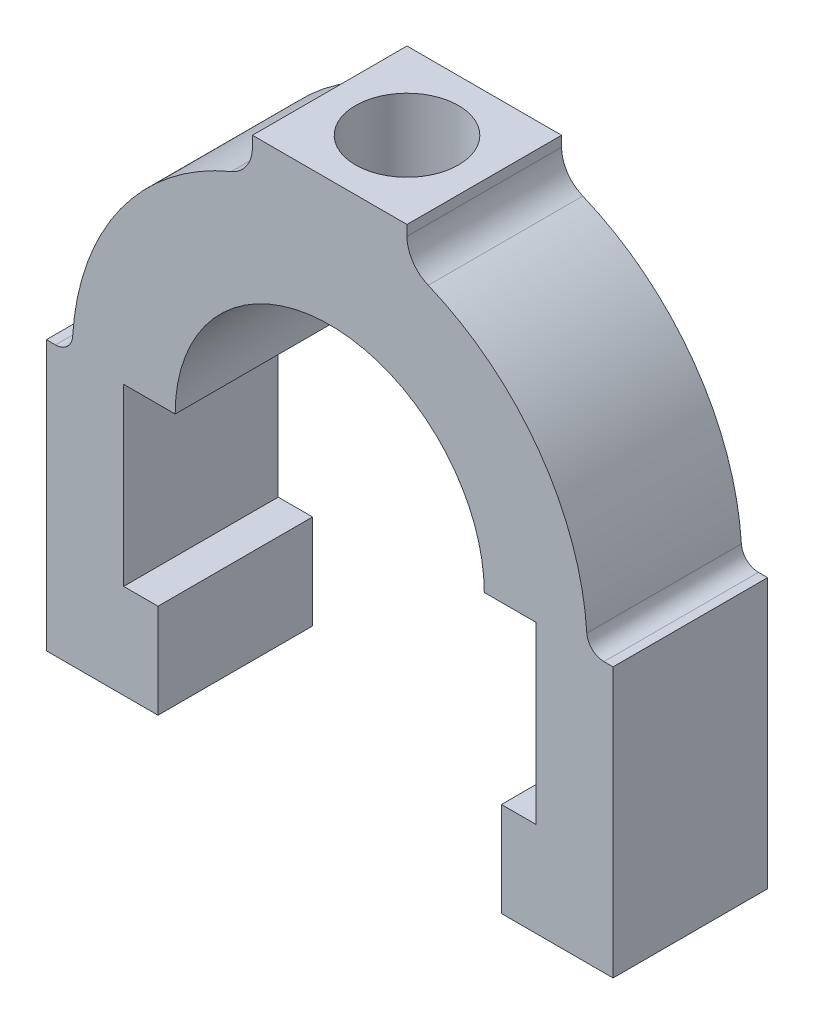
ISO-10303-21;
HEADER;
FILE_DESCRIPTION(('STEP AP214'),'2;1');
FILE_NAME('part.step','',(''),(''),'','','');
FILE_SCHEMA(('AUTOMOTIVE_DESIGN { 1 0 10303 214 1 1 1 1 }'));
ENDSEC;
DATA;
#1=APPLICATION_CONTEXT('core data for automotive mechanical design processes');
#2=APPLICATION_PROTOCOL_DEFINITION('international standard','automotive_design',2000,#1);
#3=PRODUCT_CONTEXT('',#1,'mechanical');
#4=PRODUCT('Part','Part','',(#3));
#5=PRODUCT_RELATED_PRODUCT_CATEGORY('part','',(#4));
#6=PRODUCT_DEFINITION_FORMATION('','',#4);
#7=PRODUCT_DEFINITION_CONTEXT('part definition',#1,'design');
#8=PRODUCT_DEFINITION('design','',#6,#7);
#9=PRODUCT_DEFINITION_SHAPE('','',#8);
#10=(LENGTH_UNIT() NAMED_UNIT(*) SI_UNIT(.MILLI.,.METRE.));
#11=(NAMED_UNIT(*) PLANE_ANGLE_UNIT() SI_UNIT($,.RADIAN.));
#12=(NAMED_UNIT(*) SI_UNIT($,.STERADIAN.) SOLID_ANGLE_UNIT());
#13=UNCERTAINTY_MEASURE_WITH_UNIT(LENGTH_MEASURE(1.E-05),#10,'distance_accuracy_value','');
#14=(GEOMETRIC_REPRESENTATION_CONTEXT(3) GLOBAL_UNCERTAINTY_ASSIGNED_CONTEXT((#13)) GLOBAL_UNIT_ASSIGNED_CONTEXT((#10,
#11,#12)) REPRESENTATION_CONTEXT('',''));
#15=CARTESIAN_POINT('',(0.,0.,0.));
#16=DIRECTION('',(0.,0.,1.));
#17=DIRECTION('',(1.,0.,0.));
#18=AXIS2_PLACEMENT_3D('',#15,#16,#17);
#19=CARTESIAN_POINT('',(0.,0.,9.));
#20=DIRECTION('',(0.,0.,-1.));
#21=DIRECTION('',(-1.,0.,0.));
#22=AXIS2_PLACEMENT_3D('',#19,#20,#21);
#23=CYLINDRICAL_SURFACE('',#22,30.);
#24=CARTESIAN_POINT('',(0.,0.,-9.));
#25=DIRECTION('',(0.,0.,1.));
#26=DIRECTION('',(-1.,0.,0.));
#27=AXIS2_PLACEMENT_3D('',#24,#25,#26);
#28=CIRCLE('',#27,30.);
#29=CARTESIAN_POINT('',(-11.4705882352941,27.7204907160088,-9.));
#30=VERTEX_POINT('',#29);
#31=CARTESIAN_POINT('',(-29.9413489175087,1.875,-9.));
#32=VERTEX_POINT('',#31);
#33=EDGE_CURVE('E292',#30,#32,#28,.T.);
#34=ORIENTED_EDGE('',*,*,#33,.T.);
#35=DIRECTION('',(0.,0.,-1.));
#36=VECTOR('',#35,1.);
#37=CARTESIAN_POINT('',(-29.9413489175087,1.875,9.));
#38=LINE('',#37,#36);
#39=CARTESIAN_POINT('',(-29.9413489175087,1.875,9.));
#40=VERTEX_POINT('',#39);
#41=EDGE_CURVE('E441',#32,#40,#38,.F.);
#42=ORIENTED_EDGE('',*,*,#41,.T.);
#43=CARTESIAN_POINT('',(0.,0.,9.));
#44=DIRECTION('',(0.,0.,1.));
#45=DIRECTION('',(-1.,0.,0.));
#46=AXIS2_PLACEMENT_3D('',#43,#44,#45);
#47=CIRCLE('',#46,30.);
#48=CARTESIAN_POINT('',(-11.4705882352941,27.7204907160088,9.));
#49=VERTEX_POINT('',#48);
#50=EDGE_CURVE('E220',#49,#40,#47,.T.);
#51=ORIENTED_EDGE('',*,*,#50,.F.);
#52=DIRECTION('',(0.,0.,-1.));
#53=VECTOR('',#52,1.);
#54=CARTESIAN_POINT('',(-11.4705882352941,27.7204907160088,9.));
#55=LINE('',#54,#53);
#56=EDGE_CURVE('E230',#49,#30,#55,.T.);
#57=ORIENTED_EDGE('',*,*,#56,.T.);
#58=EDGE_LOOP('',(#34,#42,#51,#57));
#59=FACE_BOUND('',#58,.T.);
#60=ADVANCED_FACE('F45',(#59),#23,.T.);
#61=CARTESIAN_POINT('',(-30.,0.,9.));
#62=DIRECTION('',(0.,-1.,0.));
#63=DIRECTION('',(1.,0.,0.));
#64=AXIS2_PLACEMENT_3D('',#61,#62,#63);
#65=PLANE('',#64);
#66=DIRECTION('',(-1.,0.,0.));
#67=VECTOR('',#66,1.);
#68=CARTESIAN_POINT('',(-30.,0.,9.));
#69=LINE('',#68,#67);
#70=CARTESIAN_POINT('',(-31.9374388453426,0.,9.));
#71=VERTEX_POINT('',#70);
#72=CARTESIAN_POINT('',(-33.,0.,9.));
#73=VERTEX_POINT('',#72);
#74=EDGE_CURVE('E206',#71,#73,#69,.T.);
#75=ORIENTED_EDGE('',*,*,#74,.F.);
#76=DIRECTION('',(0.,0.,1.));
#77=VECTOR('',#76,1.);
#78=CARTESIAN_POINT('',(-31.9374388453426,0.,-9.));
#79=LINE('',#78,#77);
#80=CARTESIAN_POINT('',(-31.9374388453426,0.,-9.));
#81=VERTEX_POINT('',#80);
#82=EDGE_CURVE('E438',#71,#81,#79,.F.);
#83=ORIENTED_EDGE('',*,*,#82,.T.);
#84=DIRECTION('',(-1.,0.,0.));
#85=VECTOR('',#84,1.);
#86=CARTESIAN_POINT('',(-30.,0.,-9.));
#87=LINE('',#86,#85);
#88=CARTESIAN_POINT('',(-33.,0.,-9.));
#89=VERTEX_POINT('',#88);
#90=EDGE_CURVE('E226',#81,#89,#87,.T.);
#91=ORIENTED_EDGE('',*,*,#90,.T.);
#92=DIRECTION('',(0.,0.,-1.));
#93=VECTOR('',#92,1.);
#94=CARTESIAN_POINT('',(-33.,0.,9.));
#95=LINE('',#94,#93);
#96=EDGE_CURVE('E223',#73,#89,#95,.T.);
#97=ORIENTED_EDGE('',*,*,#96,.F.);
#98=EDGE_LOOP('',(#75,#83,#91,#97));
#99=FACE_BOUND('',#98,.T.);
#100=ADVANCED_FACE('F224',(#99),#65,.F.);
#101=CARTESIAN_POINT('',(-33.,0.,9.));
#102=DIRECTION('',(1.,0.,0.));
#103=DIRECTION('',(0.,1.,0.));
#104=AXIS2_PLACEMENT_3D('',#101,#102,#103);
#105=PLANE('',#104);
#106=DIRECTION('',(0.,-1.,0.));
#107=VECTOR('',#106,1.);
#108=CARTESIAN_POINT('',(-33.,0.,-9.));
#109=LINE('',#108,#107);
#110=CARTESIAN_POINT('',(-33.,-31.3818239574916,-9.));
#111=VERTEX_POINT('',#110);
#112=EDGE_CURVE('E299',#89,#111,#109,.T.);
#113=ORIENTED_EDGE('',*,*,#112,.T.);
#114=DIRECTION('',(0.,0.,-1.));
#115=VECTOR('',#114,1.);
#116=CARTESIAN_POINT('',(-33.,-31.3818239574916,9.));
#117=LINE('',#116,#115);
#118=CARTESIAN_POINT('',(-33.,-31.3818239574916,9.));
#119=VERTEX_POINT('',#118);
#120=EDGE_CURVE('E231',#119,#111,#117,.T.);
#121=ORIENTED_EDGE('',*,*,#120,.F.);
#122=DIRECTION('',(0.,-1.,0.));
#123=VECTOR('',#122,1.);
#124=CARTESIAN_POINT('',(-33.,0.,9.));
#125=LINE('',#124,#123);
#126=EDGE_CURVE('E211',#73,#119,#125,.T.);
#127=ORIENTED_EDGE('',*,*,#126,.F.);
#128=ORIENTED_EDGE('',*,*,#96,.T.);
#129=EDGE_LOOP('',(#113,#121,#127,#128));
#130=FACE_BOUND('',#129,.T.);
#131=ADVANCED_FACE('F233',(#130),#105,.F.);
#132=CARTESIAN_POINT('',(-33.,-31.3818239574916,9.));
#133=DIRECTION('',(0.,1.,0.));
#134=DIRECTION('',(0.,0.,1.));
#135=AXIS2_PLACEMENT_3D('',#132,#133,#134);
#136=PLANE('',#135);
#137=DIRECTION('',(1.,0.,0.));
#138=VECTOR('',#137,1.);
#139=CARTESIAN_POINT('',(-33.,-31.3818239574916,-9.));
#140=LINE('',#139,#138);
#141=CARTESIAN_POINT('',(-20.,-31.3818239574916,-9.));
#142=VERTEX_POINT('',#141);
#143=EDGE_CURVE('E302',#111,#142,#140,.T.);
#144=ORIENTED_EDGE('',*,*,#143,.T.);
#145=DIRECTION('',(0.,0.,-1.));
#146=VECTOR('',#145,1.);
#147=CARTESIAN_POINT('',(-20.,-31.3818239574916,9.));
#148=LINE('',#147,#146);
#149=CARTESIAN_POINT('',(-20.,-31.3818239574916,9.));
#150=VERTEX_POINT('',#149);
#151=EDGE_CURVE('E405',#150,#142,#148,.T.);
#152=ORIENTED_EDGE('',*,*,#151,.F.);
#153=DIRECTION('',(1.,0.,0.));
#154=VECTOR('',#153,1.);
#155=CARTESIAN_POINT('',(-33.,-31.3818239574916,9.));
#156=LINE('',#155,#154);
#157=EDGE_CURVE('E237',#119,#150,#156,.T.);
#158=ORIENTED_EDGE('',*,*,#157,.F.);
#159=ORIENTED_EDGE('',*,*,#120,.T.);
#160=EDGE_LOOP('',(#144,#152,#158,#159));
#161=FACE_BOUND('',#160,.T.);
#162=ADVANCED_FACE('F587',(#161),#136,.F.);
#163=CARTESIAN_POINT('',(-20.,-31.3818239574916,9.));
#164=DIRECTION('',(-1.,0.,0.));
#165=DIRECTION('',(0.,0.,1.));
#166=AXIS2_PLACEMENT_3D('',#163,#164,#165);
#167=PLANE('',#166);
#168=DIRECTION('',(0.,1.,0.));
#169=VECTOR('',#168,1.);
#170=CARTESIAN_POINT('',(-20.,-31.3818239574916,-9.));
#171=LINE('',#170,#169);
#172=CARTESIAN_POINT('',(-20.,-20.3818239574916,-9.));
#173=VERTEX_POINT('',#172);
#174=EDGE_CURVE('E305',#142,#173,#171,.T.);
#175=ORIENTED_EDGE('',*,*,#174,.T.);
#176=DIRECTION('',(0.,0.,-1.));
#177=VECTOR('',#176,1.);
#178=CARTESIAN_POINT('',(-20.,-20.3818239574916,9.));
#179=LINE('',#178,#177);
#180=CARTESIAN_POINT('',(-20.,-20.3818239574916,9.));
#181=VERTEX_POINT('',#180);
#182=EDGE_CURVE('E401',#181,#173,#179,.T.);
#183=ORIENTED_EDGE('',*,*,#182,.F.);
#184=DIRECTION('',(0.,1.,0.));
#185=VECTOR('',#184,1.);
#186=CARTESIAN_POINT('',(-20.,-31.3818239574916,9.));
#187=LINE('',#186,#185);
#188=EDGE_CURVE('E240',#150,#181,#187,.T.);
#189=ORIENTED_EDGE('',*,*,#188,.F.);
#190=ORIENTED_EDGE('',*,*,#151,.T.);
#191=EDGE_LOOP('',(#175,#183,#189,#190));
#192=FACE_BOUND('',#191,.T.);
#193=ADVANCED_FACE('F583',(#192),#167,.F.);
#194=CARTESIAN_POINT('',(-20.,-20.3818239574916,9.));
#195=DIRECTION('',(0.,-1.,0.));
#196=DIRECTION('',(0.,0.,-1.));
#197=AXIS2_PLACEMENT_3D('',#194,#195,#196);
#198=PLANE('',#197);
#199=DIRECTION('',(-1.,0.,0.));
#200=VECTOR('',#199,1.);
#201=CARTESIAN_POINT('',(-20.,-20.3818239574916,-9.));
#202=LINE('',#201,#200);
#203=CARTESIAN_POINT('',(-24.,-20.3818239574916,-9.));
#204=VERTEX_POINT('',#203);
#205=EDGE_CURVE('E308',#173,#204,#202,.T.);
#206=ORIENTED_EDGE('',*,*,#205,.T.);
#207=DIRECTION('',(0.,0.,-1.));
#208=VECTOR('',#207,1.);
#209=CARTESIAN_POINT('',(-24.,-20.3818239574916,9.));
#210=LINE('',#209,#208);
#211=CARTESIAN_POINT('',(-24.,-20.3818239574916,9.));
#212=VERTEX_POINT('',#211);
#213=EDGE_CURVE('E397',#212,#204,#210,.T.);
#214=ORIENTED_EDGE('',*,*,#213,.F.);
#215=DIRECTION('',(-1.,0.,0.));
#216=VECTOR('',#215,1.);
#217=CARTESIAN_POINT('',(-20.,-20.3818239574916,9.));
#218=LINE('',#217,#216);
#219=EDGE_CURVE('E246',#181,#212,#218,.T.);
#220=ORIENTED_EDGE('',*,*,#219,.F.);
#221=ORIENTED_EDGE('',*,*,#182,.T.);
#222=EDGE_LOOP('',(#206,#214,#220,#221));
#223=FACE_BOUND('',#222,.T.);
#224=ADVANCED_FACE('F579',(#223),#198,.F.);
#225=CARTESIAN_POINT('',(-24.,-20.3818239574916,9.));
#226=DIRECTION('',(-1.,0.,0.));
#227=DIRECTION('',(0.,0.,1.));
#228=AXIS2_PLACEMENT_3D('',#225,#226,#227);
#229=PLANE('',#228);
#230=DIRECTION('',(0.,1.,0.));
#231=VECTOR('',#230,1.);
#232=CARTESIAN_POINT('',(-24.,-20.3818239574916,-9.));
#233=LINE('',#232,#231);
#234=CARTESIAN_POINT('',(-24.,0.,-9.));
#235=VERTEX_POINT('',#234);
#236=EDGE_CURVE('E311',#204,#235,#233,.T.);
#237=ORIENTED_EDGE('',*,*,#236,.T.);
#238=DIRECTION('',(0.,0.,-1.));
#239=VECTOR('',#238,1.);
#240=CARTESIAN_POINT('',(-24.,0.,9.));
#241=LINE('',#240,#239);
#242=CARTESIAN_POINT('',(-24.,0.,9.));
#243=VERTEX_POINT('',#242);
#244=EDGE_CURVE('E393',#243,#235,#241,.T.);
#245=ORIENTED_EDGE('',*,*,#244,.F.);
#246=DIRECTION('',(0.,1.,0.));
#247=VECTOR('',#246,1.);
#248=CARTESIAN_POINT('',(-24.,-20.3818239574916,9.));
#249=LINE('',#248,#247);
#250=EDGE_CURVE('E249',#212,#243,#249,.T.);
#251=ORIENTED_EDGE('',*,*,#250,.F.);
#252=ORIENTED_EDGE('',*,*,#213,.T.);
#253=EDGE_LOOP('',(#237,#245,#251,#252));
#254=FACE_BOUND('',#253,.T.);
#255=ADVANCED_FACE('F575',(#254),#229,.F.);
#256=CARTESIAN_POINT('',(-24.,0.,9.));
#257=DIRECTION('',(0.,1.,0.));
#258=DIRECTION('',(-1.,0.,0.));
#259=AXIS2_PLACEMENT_3D('',#256,#257,#258);
#260=PLANE('',#259);
#261=DIRECTION('',(1.,0.,0.));
#262=VECTOR('',#261,1.);
#263=CARTESIAN_POINT('',(-24.,0.,-9.));
#264=LINE('',#263,#262);
#265=CARTESIAN_POINT('',(-18.,0.,-9.));
#266=VERTEX_POINT('',#265);
#267=EDGE_CURVE('E314',#235,#266,#264,.T.);
#268=ORIENTED_EDGE('',*,*,#267,.T.);
#269=DIRECTION('',(0.,0.,-1.));
#270=VECTOR('',#269,1.);
#271=CARTESIAN_POINT('',(-18.,0.,9.));
#272=LINE('',#271,#270);
#273=CARTESIAN_POINT('',(-18.,0.,9.));
#274=VERTEX_POINT('',#273);
#275=EDGE_CURVE('E389',#274,#266,#272,.T.);
#276=ORIENTED_EDGE('',*,*,#275,.F.);
#277=DIRECTION('',(1.,0.,0.));
#278=VECTOR('',#277,1.);
#279=CARTESIAN_POINT('',(-24.,0.,9.));
#280=LINE('',#279,#278);
#281=EDGE_CURVE('E252',#243,#274,#280,.T.);
#282=ORIENTED_EDGE('',*,*,#281,.F.);
#283=ORIENTED_EDGE('',*,*,#244,.T.);
#284=EDGE_LOOP('',(#268,#276,#282,#283));
#285=FACE_BOUND('',#284,.T.);
#286=ADVANCED_FACE('F571',(#285),#260,.F.);
#287=CARTESIAN_POINT('',(0.,0.,9.));
#288=DIRECTION('',(0.,0.,-1.));
#289=DIRECTION('',(-1.,0.,0.));
#290=AXIS2_PLACEMENT_3D('',#287,#288,#289);
#291=CYLINDRICAL_SURFACE('',#290,18.);
#292=CARTESIAN_POINT('',(0.,18.,6.00000000000001));
#293=CARTESIAN_POINT('',(0.327379650289655,18.000001123506,6.0000023265047));
#294=CARTESIAN_POINT('',(0.654748688533562,17.9909867942918,5.97312070517746));
#295=CARTESIAN_POINT('',(1.29985304419291,17.9559119882929,5.86662304491696));
#296=CARTESIAN_POINT('',(1.61758735790783,17.9298497418759,5.78700153139131));
#297=CARTESIAN_POINT('',(2.23398736346928,17.8635207608215,5.57809293059833));
#298=CARTESIAN_POINT('',(2.53268396310175,17.8232777801419,5.44888886636663));
#299=CARTESIAN_POINT('',(3.1042846199529,17.7326582250689,5.14472171568156));
#300=CARTESIAN_POINT('',(3.37718357480982,17.6822796521554,4.96974960271144));
#301=CARTESIAN_POINT('',(3.76616319556053,17.6021139762513,4.67373393790122));
#302=CARTESIAN_POINT('',(3.8942294180292,17.5741584828372,4.56756247056504));
#303=CARTESIAN_POINT('',(4.14103139160447,17.5176437471481,4.34504566324369));
#304=CARTESIAN_POINT('',(4.25977020760167,17.4890847071399,4.22870369195644));
#305=CARTESIAN_POINT('',(4.48726302616458,17.4321038412202,3.98649013598117));
#306=CARTESIAN_POINT('',(4.59601129158695,17.4036821029209,3.86061315050774));
#307=CARTESIAN_POINT('',(4.80273826983803,17.3477712002834,3.60018484220802));
#308=CARTESIAN_POINT('',(4.90072088829396,17.3202817002612,3.46563669345216));
#309=CARTESIAN_POINT('',(5.08800724585023,17.2662087032665,3.18457637712881));
#310=CARTESIAN_POINT('',(5.17697354503101,17.2396751826829,3.03782944671992));
#311=CARTESIAN_POINT('',(5.34214016777295,17.1892116232901,2.736964636426));
#312=CARTESIAN_POINT('',(5.41834554335252,17.1652805554979,2.58284970472632));
#313=CARTESIAN_POINT('',(5.55741169583797,17.1207625674418,2.2682071931852));
#314=CARTESIAN_POINT('',(5.62027009739617,17.1001762425913,2.10767847791904));
#315=CARTESIAN_POINT('',(5.73202691492454,17.0630401245342,1.78145414427482));
#316=CARTESIAN_POINT('',(5.78093169214337,17.0464884924745,1.615760918658));
#317=CARTESIAN_POINT('',(5.86294638495678,17.0184510407943,1.2859862068502));
#318=CARTESIAN_POINT('',(5.89652807287009,17.0068148729862,1.12203481043606));
#319=CARTESIAN_POINT('',(5.94988922941377,16.9882200160252,0.79170422793202));
#320=CARTESIAN_POINT('',(5.96967445275638,16.981259376684,0.625326083675579));
#321=CARTESIAN_POINT('',(5.99526000389047,16.972243291642,0.291376402534221));
#322=CARTESIAN_POINT('',(6.00106129575105,16.9701875077948,0.123804948716409));
#323=CARTESIAN_POINT('',(5.99862030680245,16.9710505580302,-0.21122026460354));
#324=CARTESIAN_POINT('',(5.99037842226284,16.9739692517434,-0.378674027293289));
#325=CARTESIAN_POINT('',(5.96063984942074,16.9844341754675,-0.7044792823855));
#326=CARTESIAN_POINT('',(5.93976958041475,16.9917616219287,-0.862895480150734));
#327=CARTESIAN_POINT('',(5.88551353932248,17.0106306342449,-1.17736899795067));
#328=CARTESIAN_POINT('',(5.8521235554091,17.0221736182384,-1.33342550574807));
#329=CARTESIAN_POINT('',(5.7731374155462,17.0491237940853,-1.64202527661949));
#330=CARTESIAN_POINT('',(5.72754467937087,17.0645299032367,-1.79456951100698));
#331=CARTESIAN_POINT('',(5.62451111134525,17.0987666198765,-2.09526716026518));
#332=CARTESIAN_POINT('',(5.5670657806024,17.1175985273741,-2.24341888337636));
#333=CARTESIAN_POINT('',(5.43978996961936,17.1584737023369,-2.53665776063388));
#334=CARTESIAN_POINT('',(5.36977902106656,17.1805627911335,-2.68166015095766));
#335=CARTESIAN_POINT('',(5.21849496708249,17.2271173682882,-2.96532612102853));
#336=CARTESIAN_POINT('',(5.13721801376244,17.2515836677221,-3.1039875134049));
#337=CARTESIAN_POINT('',(4.96396506342482,17.3022308894506,-3.37413724932027));
#338=CARTESIAN_POINT('',(4.87198833374049,17.3284119291083,-3.50562510074467));
#339=CARTESIAN_POINT('',(4.67791711233443,17.3818071133135,-3.76068799264569));
#340=CARTESIAN_POINT('',(4.57582226284314,17.4090212943713,-3.8842627530665));
#341=CARTESIAN_POINT('',(4.35651092167621,17.4652307681598,-4.12906952466076));
#342=CARTESIAN_POINT('',(4.23878222552779,17.4942446291105,-4.24983892079909));
#343=CARTESIAN_POINT('',(3.99356544234078,17.5518457645375,-4.48105174840134));
#344=CARTESIAN_POINT('',(3.86608044237211,17.5804331705585,-4.5914984217909));
#345=CARTESIAN_POINT('',(3.60203839398285,17.6364264431102,-4.8014351482675));
#346=CARTESIAN_POINT('',(3.46547705844156,17.66383174106,-4.90091996380797));
#347=CARTESIAN_POINT('',(3.18424141551367,17.716688947922,-5.08813625898337));
#348=CARTESIAN_POINT('',(3.03957034912589,17.7421416276874,-5.17587238706145));
#349=CARTESIAN_POINT('',(2.74144779789668,17.7906577486565,-5.33982218022585));
#350=CARTESIAN_POINT('',(2.58792073088706,17.8136936325711,-5.41590672225529));
#351=CARTESIAN_POINT('',(2.27458592506743,17.8564062976005,-5.55478281972534));
#352=CARTESIAN_POINT('',(2.11478068961971,17.8760844012064,-5.61757961101266));
#353=CARTESIAN_POINT('',(1.78999322259957,17.9115215641534,-5.72934687582175));
#354=CARTESIAN_POINT('',(1.62501139705281,17.9272809299996,-5.77831843072819));
#355=CARTESIAN_POINT('',(1.29111086658729,17.954416785468,-5.86196640014444));
#356=CARTESIAN_POINT('',(1.12219234324136,17.9657934768103,-5.89664347258733));
#357=CARTESIAN_POINT('',(0.789168788155053,17.9834311786537,-5.95016009506113));
#358=CARTESIAN_POINT('',(0.625174437128374,17.9898933737321,-5.96962351896456));
#359=CARTESIAN_POINT('',(0.295964203150349,17.9983200246332,-5.99497023123316));
#360=CARTESIAN_POINT('',(0.130747919465907,18.0002829327427,-6.00084884655548));
#361=CARTESIAN_POINT('',(-0.199509552434276,17.9996513983649,-5.99895414534772));
#362=CARTESIAN_POINT('',(-0.364550787039309,17.9970593541922,-5.99118801317439));
#363=CARTESIAN_POINT('',(-0.693361592702053,17.9873931413008,-5.96208858365364));
#364=CARTESIAN_POINT('',(-0.857130672286745,17.9803173198124,-5.94075028344478));
#365=CARTESIAN_POINT('',(-1.17733651912546,17.9621501229369,-5.885532591795));
#366=CARTESIAN_POINT('',(-1.33384731153101,17.9511829004167,-5.85204028867007));
#367=CARTESIAN_POINT('',(-1.64345814456252,17.9254899139335,-5.77274582664115));
#368=CARTESIAN_POINT('',(-1.79655695572469,17.910762818218,-5.72693930571762));
#369=CARTESIAN_POINT('',(-2.0982565498418,17.8779285210375,-5.62340992963252));
#370=CARTESIAN_POINT('',(-2.24685853242728,17.8598222304539,-5.56569028527878));
#371=CARTESIAN_POINT('',(-2.53870192503155,17.8206824064423,-5.43878203882837));
#372=CARTESIAN_POINT('',(-2.68194138840117,17.7996478228409,-5.36958932043648));
#373=CARTESIAN_POINT('',(-3.10955308705348,17.7317545667084,-5.14165694660146));
#374=CARTESIAN_POINT('',(-3.38410495409262,17.6809813742354,-4.96520880969209));
#375=CARTESIAN_POINT('',(-3.90046380489827,17.5743027422684,-4.57077871329005));
#376=CARTESIAN_POINT('',(-4.14226074948704,17.5183957380628,-4.35278406910609));
#377=CARTESIAN_POINT('',(-4.48120075410061,17.4336826212657,-3.9934553932898));
#378=CARTESIAN_POINT('',(-4.59235115980605,17.4046627531,-3.86511883684043));
#379=CARTESIAN_POINT('',(-4.80346249277619,17.3475844522084,-3.59937617807722));
#380=CARTESIAN_POINT('',(-4.9034273442786,17.3195256847111,-3.46197328357883));
#381=CARTESIAN_POINT('',(-5.09152241657998,17.2651671618791,-3.17888353544383));
#382=CARTESIAN_POINT('',(-5.17964753663558,17.2388681671157,-3.03319314965323));
#383=CARTESIAN_POINT('',(-5.34332580832153,17.1888391626455,-2.73456481947393));
#384=CARTESIAN_POINT('',(-5.41888421002776,17.1651080815805,-2.58162993614711));
#385=CARTESIAN_POINT('',(-5.55674325657251,17.1209765842434,-2.26972057554986));
#386=CARTESIAN_POINT('',(-5.61906451465578,17.1005710011209,-2.11075594980542));
#387=CARTESIAN_POINT('',(-5.73001985812799,17.0637127452484,-1.78774169753999));
#388=CARTESIAN_POINT('',(-5.77865956483044,17.047258449448,-1.62369419025971));
#389=CARTESIAN_POINT('',(-5.86180765260837,17.0188467426427,-1.29169994447399));
#390=CARTESIAN_POINT('',(-5.89631843745228,17.0068885667365,-1.12375387437705));
#391=CARTESIAN_POINT('',(-5.95086210077739,16.9878803440502,-0.785254584220835));
#392=CARTESIAN_POINT('',(-5.97089570887974,16.980830049923,-0.614701495992567));
#393=CARTESIAN_POINT('',(-5.99561670735592,16.9721165300556,-0.281210688256416));
#394=CARTESIAN_POINT('',(-6.00104252908575,16.9701941359792,-0.118334053779589));
#395=CARTESIAN_POINT('',(-5.99862718574831,16.971048132718,0.207366276937523));
#396=CARTESIAN_POINT('',(-5.99078151118915,16.9738261206655,0.370189936373837));
#397=CARTESIAN_POINT('',(-5.96189837770534,16.9839924705695,0.694443088382819));
#398=CARTESIAN_POINT('',(-5.94086667700385,16.9913788200877,0.855873158345242));
#399=CARTESIAN_POINT('',(-5.88580987344676,17.010528799585,1.17629853099465));
#400=CARTESIAN_POINT('',(-5.85177988955103,17.02229407387,1.33529289568337));
#401=CARTESIAN_POINT('',(-5.77182751147201,17.0495675106714,1.64661267600511));
#402=CARTESIAN_POINT('',(-5.72614898895514,17.0649985214979,1.79900764331357));
#403=CARTESIAN_POINT('',(-5.62296574413083,17.0992751394136,2.09940161935453));
#404=CARTESIAN_POINT('',(-5.56545681111229,17.1181219619827,2.24739904137767));
#405=CARTESIAN_POINT('',(-5.43907961849349,17.1586949560773,2.53801399942579));
#406=CARTESIAN_POINT('',(-5.37021353557007,17.1804205757049,2.68063255992394));
#407=CARTESIAN_POINT('',(-5.22158108093292,17.2261759837312,2.95974746357768));
#408=CARTESIAN_POINT('',(-5.14181056316171,17.2502066475064,3.09624145171727));
#409=CARTESIAN_POINT('',(-4.96822239816028,17.3010197763056,3.36806664670174));
#410=CARTESIAN_POINT('',(-4.87394621391853,17.3278763260538,3.50309185339549));
#411=CARTESIAN_POINT('',(-4.67473803525017,17.3826786842874,3.76482594594378));
#412=CARTESIAN_POINT('',(-4.56980207786682,17.4106248954769,3.8915317098669));
#413=CARTESIAN_POINT('',(-4.23997033318676,17.4949712765604,4.2579908065868));
#414=CARTESIAN_POINT('',(-3.99991932392138,17.5519192865978,4.48429107663514));
#415=CARTESIAN_POINT('',(-3.47541732325492,17.6634103595779,4.9029084248834));
#416=CARTESIAN_POINT('',(-3.18960052896001,17.7177731925948,5.09355732051543));
#417=CARTESIAN_POINT('',(-2.58815269428971,17.815557186422,5.42393134196919));
#418=CARTESIAN_POINT('',(-2.27252930193347,17.8589811435868,5.56366948642237));
#419=CARTESIAN_POINT('',(-1.63495978805023,17.9283314877085,5.78233265049631));
#420=CARTESIAN_POINT('',(-1.31392615559421,17.9549529431752,5.86369571468174));
#421=CARTESIAN_POINT('',(-0.6619228864178,17.9907842260842,5.97252076721479));
#422=CARTESIAN_POINT('',(-0.330956020624391,17.9999988642206,5.99999764808006));
#423=CARTESIAN_POINT('',(0.,18.,6.00000000000001));
#424=B_SPLINE_CURVE_WITH_KNOTS('',3,(#292,#293,#294,#295,#296,#297,#298,#299,#300,#301,#302,
#303,#304,#305,#306,#307,#308,#309,#310,#311,#312,#313,#314,#315,#316,#317,#318,#319,#320,#321,
#322,#323,#324,#325,#326,#327,#328,#329,#330,#331,#332,#333,#334,#335,#336,#337,#338,#339,#340,
#341,#342,#343,#344,#345,#346,#347,#348,#349,#350,#351,#352,#353,#354,#355,#356,#357,#358,#359,
#360,#361,#362,#363,#364,#365,#366,#367,#368,#369,#370,#371,#372,#373,#374,#375,#376,#377,#378,
#379,#380,#381,#382,#383,#384,#385,#386,#387,#388,#389,#390,#391,#392,#393,#394,#395,#396,#397,
#398,#399,#400,#401,#402,#403,#404,#405,#406,#407,#408,#409,#410,#411,#412,#413,#414,#415,#416,
#417,#418,#419,#420,#421,#422,#423),.UNSPECIFIED.,.T.,.F.,(4,2,2,2,2,2,2,2,2,2,2,2,2,2,2,2,2,2,
2,2,2,2,2,2,2,2,2,2,2,2,2,2,2,2,2,2,2,2,2,2,2,2,2,2,2,2,2,2,2,2,2,2,2,2,2,2,2,2,2,2,2,2,2,2,2,
4),(0.,0.980922636156068,1.96194711160513,2.94133603722165,3.92091826679461,4.42650795800367,
4.93193081656493,5.43764212680677,5.94316936197256,6.46347458360148,6.98357332815681,
7.50376455673093,8.02371825760203,8.52635611322415,9.02878418544485,9.53117761867723,
10.0335568756344,10.5128532711172,10.9923110542535,11.4716346116346,11.9511404417982,
12.4381827239463,12.9253917665144,13.4126341903618,13.8998938489077,14.4127033790737,
14.9253513126936,15.4382431356103,15.9509314262095,16.4689439882804,16.9867520532929,
17.5045196050785,18.0222633228811,18.517462598168,19.0128321918786,19.5079410372374,
20.003232491415,20.4839646652066,20.9648673518609,21.4456405951742,21.9265867044307,
22.9127919780087,23.899298836698,24.4155088763846,24.931537242041,25.4477872128305,
25.9638209619367,26.4790451400542,26.9940573187272,27.5089818413857,28.0238804110535,
28.5122138127281,29.0007131774442,29.4889993671702,29.9774690958509,30.4564495222617,
30.9356007245367,31.4146602006447,31.8939023328471,32.3938860688241,32.8940563675105,
33.8936650334289,34.9322320161082,35.9705332351496,36.962445868431,37.9540843282906),.UNSPECIFIED.);
#425=CARTESIAN_POINT('',(0.,18.,6.00000000000001));
#426=VERTEX_POINT('',#425);
#427=EDGE_CURVE('E296',#426,#426,#424,.T.);
#428=ORIENTED_EDGE('',*,*,#427,.T.);
#429=EDGE_LOOP('',(#428));
#430=FACE_BOUND('',#429,.T.);
#431=CARTESIAN_POINT('',(0.,0.,-9.));
#432=DIRECTION('',(0.,0.,-1.));
#433=DIRECTION('',(-1.,0.,0.));
#434=AXIS2_PLACEMENT_3D('',#431,#432,#433);
#435=CIRCLE('',#434,18.);
#436=CARTESIAN_POINT('',(18.,0.,-9.));
#437=VERTEX_POINT('',#436);
#438=EDGE_CURVE('E317',#266,#437,#435,.T.);
#439=ORIENTED_EDGE('',*,*,#438,.T.);
#440=DIRECTION('',(0.,0.,-1.));
#441=VECTOR('',#440,1.);
#442=CARTESIAN_POINT('',(18.,0.,9.));
#443=LINE('',#442,#441);
#444=CARTESIAN_POINT('',(18.,0.,9.));
#445=VERTEX_POINT('',#444);
#446=EDGE_CURVE('E385',#445,#437,#443,.T.);
#447=ORIENTED_EDGE('',*,*,#446,.F.);
#448=CARTESIAN_POINT('',(0.,0.,9.));
#449=DIRECTION('',(0.,0.,-1.));
#450=DIRECTION('',(-1.,0.,0.));
#451=AXIS2_PLACEMENT_3D('',#448,#449,#450);
#452=CIRCLE('',#451,18.);
#453=EDGE_CURVE('E255',#274,#445,#452,.T.);
#454=ORIENTED_EDGE('',*,*,#453,.F.);
#455=ORIENTED_EDGE('',*,*,#275,.T.);
#456=EDGE_LOOP('',(#439,#447,#454,#455));
#457=FACE_BOUND('',#456,.T.);
#458=ADVANCED_FACE('F567',(#430,#457),#291,.F.);
#459=CARTESIAN_POINT('',(24.,0.,9.));
#460=DIRECTION('',(0.,1.,0.));
#461=DIRECTION('',(-1.,0.,0.));
#462=AXIS2_PLACEMENT_3D('',#459,#460,#461);
#463=PLANE('',#462);
#464=DIRECTION('',(1.,0.,0.));
#465=VECTOR('',#464,1.);
#466=CARTESIAN_POINT('',(24.,0.,-9.));
#467=LINE('',#466,#465);
#468=CARTESIAN_POINT('',(24.,0.,-9.));
#469=VERTEX_POINT('',#468);
#470=EDGE_CURVE('E320',#437,#469,#467,.T.);
#471=ORIENTED_EDGE('',*,*,#470,.T.);
#472=DIRECTION('',(0.,0.,-1.));
#473=VECTOR('',#472,1.);
#474=CARTESIAN_POINT('',(24.,0.,9.));
#475=LINE('',#474,#473);
#476=CARTESIAN_POINT('',(24.,0.,9.));
#477=VERTEX_POINT('',#476);
#478=EDGE_CURVE('E381',#477,#469,#475,.T.);
#479=ORIENTED_EDGE('',*,*,#478,.F.);
#480=DIRECTION('',(1.,0.,0.));
#481=VECTOR('',#480,1.);
#482=CARTESIAN_POINT('',(24.,0.,9.));
#483=LINE('',#482,#481);
#484=EDGE_CURVE('E258',#445,#477,#483,.T.);
#485=ORIENTED_EDGE('',*,*,#484,.F.);
#486=ORIENTED_EDGE('',*,*,#446,.T.);
#487=EDGE_LOOP('',(#471,#479,#485,#486));
#488=FACE_BOUND('',#487,.T.);
#489=ADVANCED_FACE('F563',(#488),#463,.F.);
#490=CARTESIAN_POINT('',(24.,-20.3818239574916,9.));
#491=DIRECTION('',(1.,0.,0.));
#492=DIRECTION('',(0.,0.,-1.));
#493=AXIS2_PLACEMENT_3D('',#490,#491,#492);
#494=PLANE('',#493);
#495=DIRECTION('',(0.,-1.,0.));
#496=VECTOR('',#495,1.);
#497=CARTESIAN_POINT('',(24.,-20.3818239574916,-9.));
#498=LINE('',#497,#496);
#499=CARTESIAN_POINT('',(24.,-20.3818239574916,-9.));
#500=VERTEX_POINT('',#499);
#501=EDGE_CURVE('E323',#469,#500,#498,.T.);
#502=ORIENTED_EDGE('',*,*,#501,.T.);
#503=DIRECTION('',(0.,0.,-1.));
#504=VECTOR('',#503,1.);
#505=CARTESIAN_POINT('',(24.,-20.3818239574916,9.));
#506=LINE('',#505,#504);
#507=CARTESIAN_POINT('',(24.,-20.3818239574916,9.));
#508=VERTEX_POINT('',#507);
#509=EDGE_CURVE('E377',#508,#500,#506,.T.);
#510=ORIENTED_EDGE('',*,*,#509,.F.);
#511=DIRECTION('',(0.,-1.,0.));
#512=VECTOR('',#511,1.);
#513=CARTESIAN_POINT('',(24.,-20.3818239574916,9.));
#514=LINE('',#513,#512);
#515=EDGE_CURVE('E261',#477,#508,#514,.T.);
#516=ORIENTED_EDGE('',*,*,#515,.F.);
#517=ORIENTED_EDGE('',*,*,#478,.T.);
#518=EDGE_LOOP('',(#502,#510,#516,#517));
#519=FACE_BOUND('',#518,.T.);
#520=ADVANCED_FACE('F559',(#519),#494,.F.);
#521=CARTESIAN_POINT('',(20.,-20.3818239574916,9.));
#522=DIRECTION('',(0.,-1.,0.));
#523=DIRECTION('',(0.,0.,-1.));
#524=AXIS2_PLACEMENT_3D('',#521,#522,#523);
#525=PLANE('',#524);
#526=DIRECTION('',(-1.,0.,0.));
#527=VECTOR('',#526,1.);
#528=CARTESIAN_POINT('',(20.,-20.3818239574916,-9.));
#529=LINE('',#528,#527);
#530=CARTESIAN_POINT('',(20.,-20.3818239574916,-9.));
#531=VERTEX_POINT('',#530);
#532=EDGE_CURVE('E326',#500,#531,#529,.T.);
#533=ORIENTED_EDGE('',*,*,#532,.T.);
#534=DIRECTION('',(0.,0.,-1.));
#535=VECTOR('',#534,1.);
#536=CARTESIAN_POINT('',(20.,-20.3818239574916,9.));
#537=LINE('',#536,#535);
#538=CARTESIAN_POINT('',(20.,-20.3818239574916,9.));
#539=VERTEX_POINT('',#538);
#540=EDGE_CURVE('E373',#539,#531,#537,.T.);
#541=ORIENTED_EDGE('',*,*,#540,.F.);
#542=DIRECTION('',(-1.,0.,0.));
#543=VECTOR('',#542,1.);
#544=CARTESIAN_POINT('',(20.,-20.3818239574916,9.));
#545=LINE('',#544,#543);
#546=EDGE_CURVE('E264',#508,#539,#545,.T.);
#547=ORIENTED_EDGE('',*,*,#546,.F.);
#548=ORIENTED_EDGE('',*,*,#509,.T.);
#549=EDGE_LOOP('',(#533,#541,#547,#548));
#550=FACE_BOUND('',#549,.T.);
#551=ADVANCED_FACE('F555',(#550),#525,.F.);
#552=CARTESIAN_POINT('',(20.,-31.3818239574916,9.));
#553=DIRECTION('',(1.,0.,0.));
#554=DIRECTION('',(0.,0.,-1.));
#555=AXIS2_PLACEMENT_3D('',#552,#553,#554);
#556=PLANE('',#555);
#557=DIRECTION('',(0.,-1.,0.));
#558=VECTOR('',#557,1.);
#559=CARTESIAN_POINT('',(20.,-31.3818239574916,-9.));
#560=LINE('',#559,#558);
#561=CARTESIAN_POINT('',(20.,-31.3818239574916,-9.));
#562=VERTEX_POINT('',#561);
#563=EDGE_CURVE('E329',#531,#562,#560,.T.);
#564=ORIENTED_EDGE('',*,*,#563,.T.);
#565=DIRECTION('',(0.,0.,-1.));
#566=VECTOR('',#565,1.);
#567=CARTESIAN_POINT('',(20.,-31.3818239574916,9.));
#568=LINE('',#567,#566);
#569=CARTESIAN_POINT('',(20.,-31.3818239574916,9.));
#570=VERTEX_POINT('',#569);
#571=EDGE_CURVE('E369',#570,#562,#568,.T.);
#572=ORIENTED_EDGE('',*,*,#571,.F.);
#573=DIRECTION('',(0.,-1.,0.));
#574=VECTOR('',#573,1.);
#575=CARTESIAN_POINT('',(20.,-31.3818239574916,9.));
#576=LINE('',#575,#574);
#577=EDGE_CURVE('E267',#539,#570,#576,.T.);
#578=ORIENTED_EDGE('',*,*,#577,.F.);
#579=ORIENTED_EDGE('',*,*,#540,.T.);
#580=EDGE_LOOP('',(#564,#572,#578,#579));
#581=FACE_BOUND('',#580,.T.);
#582=ADVANCED_FACE('F551',(#581),#556,.F.);
#583=CARTESIAN_POINT('',(33.,-31.3818239574916,9.));
#584=DIRECTION('',(0.,1.,0.));
#585=DIRECTION('',(0.,0.,1.));
#586=AXIS2_PLACEMENT_3D('',#583,#584,#585);
#587=PLANE('',#586);
#588=DIRECTION('',(1.,0.,0.));
#589=VECTOR('',#588,1.);
#590=CARTESIAN_POINT('',(33.,-31.3818239574916,-9.));
#591=LINE('',#590,#589);
#592=CARTESIAN_POINT('',(33.,-31.3818239574916,-9.));
#593=VERTEX_POINT('',#592);
#594=EDGE_CURVE('E332',#562,#593,#591,.T.);
#595=ORIENTED_EDGE('',*,*,#594,.T.);
#596=DIRECTION('',(0.,0.,-1.));
#597=VECTOR('',#596,1.);
#598=CARTESIAN_POINT('',(33.,-31.3818239574916,9.));
#599=LINE('',#598,#597);
#600=CARTESIAN_POINT('',(33.,-31.3818239574916,9.));
#601=VERTEX_POINT('',#600);
#602=EDGE_CURVE('E365',#601,#593,#599,.T.);
#603=ORIENTED_EDGE('',*,*,#602,.F.);
#604=DIRECTION('',(1.,0.,0.));
#605=VECTOR('',#604,1.);
#606=CARTESIAN_POINT('',(33.,-31.3818239574916,9.));
#607=LINE('',#606,#605);
#608=EDGE_CURVE('E270',#570,#601,#607,.T.);
#609=ORIENTED_EDGE('',*,*,#608,.F.);
#610=ORIENTED_EDGE('',*,*,#571,.T.);
#611=EDGE_LOOP('',(#595,#603,#609,#610));
#612=FACE_BOUND('',#611,.T.);
#613=ADVANCED_FACE('F547',(#612),#587,.F.);
#614=CARTESIAN_POINT('',(33.,0.,9.));
#615=DIRECTION('',(-1.,0.,0.));
#616=DIRECTION('',(0.,-1.,0.));
#617=AXIS2_PLACEMENT_3D('',#614,#615,#616);
#618=PLANE('',#617);
#619=DIRECTION('',(0.,1.,0.));
#620=VECTOR('',#619,1.);
#621=CARTESIAN_POINT('',(33.,0.,-9.));
#622=LINE('',#621,#620);
#623=CARTESIAN_POINT('',(33.,0.,-9.));
#624=VERTEX_POINT('',#623);
#625=EDGE_CURVE('E335',#593,#624,#622,.T.);
#626=ORIENTED_EDGE('',*,*,#625,.T.);
#627=DIRECTION('',(0.,0.,-1.));
#628=VECTOR('',#627,1.);
#629=CARTESIAN_POINT('',(33.,0.,9.));
#630=LINE('',#629,#628);
#631=CARTESIAN_POINT('',(33.,0.,9.));
#632=VERTEX_POINT('',#631);
#633=EDGE_CURVE('E361',#632,#624,#630,.T.);
#634=ORIENTED_EDGE('',*,*,#633,.F.);
#635=DIRECTION('',(0.,1.,0.));
#636=VECTOR('',#635,1.);
#637=CARTESIAN_POINT('',(33.,0.,9.));
#638=LINE('',#637,#636);
#639=EDGE_CURVE('E273',#601,#632,#638,.T.);
#640=ORIENTED_EDGE('',*,*,#639,.F.);
#641=ORIENTED_EDGE('',*,*,#602,.T.);
#642=EDGE_LOOP('',(#626,#634,#640,#641));
#643=FACE_BOUND('',#642,.T.);
#644=ADVANCED_FACE('F544',(#643),#618,.F.);
#645=CARTESIAN_POINT('',(30.,0.,9.));
#646=DIRECTION('',(0.,-1.,0.));
#647=DIRECTION('',(1.,0.,0.));
#648=AXIS2_PLACEMENT_3D('',#645,#646,#647);
#649=PLANE('',#648);
#650=DIRECTION('',(-1.,0.,0.));
#651=VECTOR('',#650,1.);
#652=CARTESIAN_POINT('',(30.,0.,-9.));
#653=LINE('',#652,#651);
#654=CARTESIAN_POINT('',(31.9374388453426,0.,-9.));
#655=VERTEX_POINT('',#654);
#656=EDGE_CURVE('E338',#624,#655,#653,.T.);
#657=ORIENTED_EDGE('',*,*,#656,.T.);
#658=DIRECTION('',(0.,0.,1.));
#659=VECTOR('',#658,1.);
#660=CARTESIAN_POINT('',(31.9374388453426,0.,9.));
#661=LINE('',#660,#659);
#662=CARTESIAN_POINT('',(31.9374388453426,0.,9.));
#663=VERTEX_POINT('',#662);
#664=EDGE_CURVE('E61',#655,#663,#661,.T.);
#665=ORIENTED_EDGE('',*,*,#664,.T.);
#666=DIRECTION('',(-1.,0.,0.));
#667=VECTOR('',#666,1.);
#668=CARTESIAN_POINT('',(30.,0.,9.));
#669=LINE('',#668,#667);
#670=EDGE_CURVE('E276',#632,#663,#669,.T.);
#671=ORIENTED_EDGE('',*,*,#670,.F.);
#672=ORIENTED_EDGE('',*,*,#633,.T.);
#673=EDGE_LOOP('',(#657,#665,#671,#672));
#674=FACE_BOUND('',#673,.T.);
#675=ADVANCED_FACE('F540',(#674),#649,.F.);
#676=CARTESIAN_POINT('',(0.,0.,9.));
#677=DIRECTION('',(0.,0.,-1.));
#678=DIRECTION('',(-1.,0.,0.));
#679=AXIS2_PLACEMENT_3D('',#676,#677,#678);
#680=CYLINDRICAL_SURFACE('',#679,30.);
#681=CARTESIAN_POINT('',(0.,0.,9.));
#682=DIRECTION('',(0.,0.,1.));
#683=DIRECTION('',(-1.,0.,0.));
#684=AXIS2_PLACEMENT_3D('',#681,#682,#683);
#685=CIRCLE('',#684,30.);
#686=CARTESIAN_POINT('',(29.9413489175087,1.875,9.));
#687=VERTEX_POINT('',#686);
#688=CARTESIAN_POINT('',(11.4705882352941,27.7204907160088,9.));
#689=VERTEX_POINT('',#688);
#690=EDGE_CURVE('E279',#687,#689,#685,.T.);
#691=ORIENTED_EDGE('',*,*,#690,.F.);
#692=DIRECTION('',(0.,0.,-1.));
#693=VECTOR('',#692,1.);
#694=CARTESIAN_POINT('',(29.9413489175087,1.875,9.));
#695=LINE('',#694,#693);
#696=CARTESIAN_POINT('',(29.9413489175087,1.875,-9.));
#697=VERTEX_POINT('',#696);
#698=EDGE_CURVE('E444',#687,#697,#695,.T.);
#699=ORIENTED_EDGE('',*,*,#698,.T.);
#700=CARTESIAN_POINT('',(0.,0.,-9.));
#701=DIRECTION('',(0.,0.,1.));
#702=DIRECTION('',(-1.,0.,0.));
#703=AXIS2_PLACEMENT_3D('',#700,#701,#702);
#704=CIRCLE('',#703,30.);
#705=CARTESIAN_POINT('',(11.4705882352941,27.7204907160088,-9.));
#706=VERTEX_POINT('',#705);
#707=EDGE_CURVE('E341',#697,#706,#704,.T.);
#708=ORIENTED_EDGE('',*,*,#707,.T.);
#709=DIRECTION('',(0.,0.,-1.));
#710=VECTOR('',#709,1.);
#711=CARTESIAN_POINT('',(11.4705882352941,27.7204907160088,9.));
#712=LINE('',#711,#710);
#713=EDGE_CURVE('E421',#706,#689,#712,.F.);
#714=ORIENTED_EDGE('',*,*,#713,.T.);
#715=EDGE_LOOP('',(#691,#699,#708,#714));
#716=FACE_BOUND('',#715,.T.);
#717=ADVANCED_FACE('F536',(#716),#680,.T.);
#718=CARTESIAN_POINT('',(8.99999999999999,32.6181760425084,9.));
#719=DIRECTION('',(-1.,0.,0.));
#720=DIRECTION('',(0.,-1.,0.));
#721=AXIS2_PLACEMENT_3D('',#718,#719,#720);
#722=PLANE('',#721);
#723=DIRECTION('',(0.,1.,0.));
#724=VECTOR('',#723,1.);
#725=CARTESIAN_POINT('',(8.99999999999999,32.6181760425084,9.));
#726=LINE('',#725,#724);
#727=CARTESIAN_POINT('',(8.99999999999999,31.41655614481,9.));
#728=VERTEX_POINT('',#727);
#729=CARTESIAN_POINT('',(8.99999999999999,32.6181760425084,9.));
#730=VERTEX_POINT('',#729);
#731=EDGE_CURVE('E282',#728,#730,#726,.T.);
#732=ORIENTED_EDGE('',*,*,#731,.F.);
#733=DIRECTION('',(0.,0.,1.));
#734=VECTOR('',#733,1.);
#735=CARTESIAN_POINT('',(8.99999999999999,31.41655614481,-9.));
#736=LINE('',#735,#734);
#737=CARTESIAN_POINT('',(8.99999999999999,31.41655614481,-9.));
#738=VERTEX_POINT('',#737);
#739=EDGE_CURVE('E417',#728,#738,#736,.F.);
#740=ORIENTED_EDGE('',*,*,#739,.T.);
#741=DIRECTION('',(0.,1.,0.));
#742=VECTOR('',#741,1.);
#743=CARTESIAN_POINT('',(8.99999999999999,32.6181760425084,-9.));
#744=LINE('',#743,#742);
#745=CARTESIAN_POINT('',(8.99999999999999,32.6181760425084,-9.));
#746=VERTEX_POINT('',#745);
#747=EDGE_CURVE('E344',#738,#746,#744,.T.);
#748=ORIENTED_EDGE('',*,*,#747,.T.);
#749=DIRECTION('',(0.,0.,-1.));
#750=VECTOR('',#749,1.);
#751=CARTESIAN_POINT('',(8.99999999999999,32.6181760425084,9.));
#752=LINE('',#751,#750);
#753=EDGE_CURVE('E357',#730,#746,#752,.T.);
#754=ORIENTED_EDGE('',*,*,#753,.F.);
#755=EDGE_LOOP('',(#732,#740,#748,#754));
#756=FACE_BOUND('',#755,.T.);
#757=ADVANCED_FACE('F520',(#756),#722,.F.);
#758=CARTESIAN_POINT('',(-9.00000000000001,32.6181760425084,9.));
#759=DIRECTION('',(0.,-1.,0.));
#760=DIRECTION('',(0.,0.,-1.));
#761=AXIS2_PLACEMENT_3D('',#758,#759,#760);
#762=PLANE('',#761);
#763=CARTESIAN_POINT('',(0.,32.6181760425084,0.));
#764=DIRECTION('',(0.,1.,0.));
#765=DIRECTION('',(0.,0.,1.));
#766=AXIS2_PLACEMENT_3D('',#763,#764,#765);
#767=CIRCLE('',#766,6.00000000000001);
#768=CARTESIAN_POINT('',(0.,32.6181760425084,6.00000000000001));
#769=VERTEX_POINT('',#768);
#770=EDGE_CURVE('E502',#769,#769,#767,.T.);
#771=ORIENTED_EDGE('',*,*,#770,.F.);
#772=EDGE_LOOP('',(#771));
#773=FACE_BOUND('',#772,.T.);
#774=DIRECTION('',(-1.,0.,0.));
#775=VECTOR('',#774,1.);
#776=CARTESIAN_POINT('',(-9.00000000000001,32.6181760425084,-9.));
#777=LINE('',#776,#775);
#778=CARTESIAN_POINT('',(-9.00000000000001,32.6181760425084,-9.));
#779=VERTEX_POINT('',#778);
#780=EDGE_CURVE('E347',#746,#779,#777,.T.);
#781=ORIENTED_EDGE('',*,*,#780,.T.);
#782=DIRECTION('',(0.,0.,-1.));
#783=VECTOR('',#782,1.);
#784=CARTESIAN_POINT('',(-9.00000000000001,32.6181760425084,9.));
#785=LINE('',#784,#783);
#786=CARTESIAN_POINT('',(-9.00000000000001,32.6181760425084,9.));
#787=VERTEX_POINT('',#786);
#788=EDGE_CURVE('E291',#787,#779,#785,.T.);
#789=ORIENTED_EDGE('',*,*,#788,.F.);
#790=DIRECTION('',(-1.,0.,0.));
#791=VECTOR('',#790,1.);
#792=CARTESIAN_POINT('',(-9.00000000000001,32.6181760425084,9.));
#793=LINE('',#792,#791);
#794=EDGE_CURVE('E285',#730,#787,#793,.T.);
#795=ORIENTED_EDGE('',*,*,#794,.F.);
#796=ORIENTED_EDGE('',*,*,#753,.T.);
#797=EDGE_LOOP('',(#781,#789,#795,#796));
#798=FACE_BOUND('',#797,.T.);
#799=ADVANCED_FACE('F517',(#773,#798),#762,.F.);
#800=CARTESIAN_POINT('',(-9.00000000000001,32.6181760425084,9.));
#801=DIRECTION('',(1.,0.,0.));
#802=DIRECTION('',(0.,1.,0.));
#803=AXIS2_PLACEMENT_3D('',#800,#801,#802);
#804=PLANE('',#803);
#805=DIRECTION('',(0.,-1.,0.));
#806=VECTOR('',#805,1.);
#807=CARTESIAN_POINT('',(-9.00000000000001,32.6181760425084,-9.));
#808=LINE('',#807,#806);
#809=CARTESIAN_POINT('',(-9.00000000000001,31.41655614481,-9.));
#810=VERTEX_POINT('',#809);
#811=EDGE_CURVE('E350',#779,#810,#808,.T.);
#812=ORIENTED_EDGE('',*,*,#811,.T.);
#813=DIRECTION('',(0.,0.,1.));
#814=VECTOR('',#813,1.);
#815=CARTESIAN_POINT('',(-9.00000000000001,31.41655614481,9.));
#816=LINE('',#815,#814);
#817=CARTESIAN_POINT('',(-9.00000000000001,31.41655614481,9.));
#818=VERTEX_POINT('',#817);
#819=EDGE_CURVE('E414',#810,#818,#816,.T.);
#820=ORIENTED_EDGE('',*,*,#819,.T.);
#821=DIRECTION('',(0.,-1.,0.));
#822=VECTOR('',#821,1.);
#823=CARTESIAN_POINT('',(-9.00000000000001,32.6181760425084,9.));
#824=LINE('',#823,#822);
#825=EDGE_CURVE('E288',#787,#818,#824,.T.);
#826=ORIENTED_EDGE('',*,*,#825,.F.);
#827=ORIENTED_EDGE('',*,*,#788,.T.);
#828=EDGE_LOOP('',(#812,#820,#826,#827));
#829=FACE_BOUND('',#828,.T.);
#830=ADVANCED_FACE('F519',(#829),#804,.F.);
#831=CARTESIAN_POINT('',(0.,0.,9.));
#832=DIRECTION('',(0.,0.,-1.));
#833=DIRECTION('',(-1.,0.,0.));
#834=AXIS2_PLACEMENT_3D('',#831,#832,#833);
#835=PLANE('',#834);
#836=ORIENTED_EDGE('',*,*,#825,.T.);
#837=CARTESIAN_POINT('',(-13.,31.41655614481,9.));
#838=DIRECTION('',(0.,0.,-1.));
#839=DIRECTION('',(-1.,0.,0.));
#840=AXIS2_PLACEMENT_3D('',#837,#838,#839);
#841=CIRCLE('',#840,4.);
#842=EDGE_CURVE('E428',#818,#49,#841,.T.);
#843=ORIENTED_EDGE('',*,*,#842,.T.);
#844=ORIENTED_EDGE('',*,*,#50,.T.);
#845=CARTESIAN_POINT('',(-31.9374388453426,2.,9.));
#846=DIRECTION('',(0.,0.,-1.));
#847=DIRECTION('',(-1.,0.,0.));
#848=AXIS2_PLACEMENT_3D('',#845,#846,#847);
#849=CIRCLE('',#848,2.);
#850=EDGE_CURVE('E215',#40,#71,#849,.T.);
#851=ORIENTED_EDGE('',*,*,#850,.T.);
#852=ORIENTED_EDGE('',*,*,#74,.T.);
#853=ORIENTED_EDGE('',*,*,#126,.T.);
#854=ORIENTED_EDGE('',*,*,#157,.T.);
#855=ORIENTED_EDGE('',*,*,#188,.T.);
#856=ORIENTED_EDGE('',*,*,#219,.T.);
#857=ORIENTED_EDGE('',*,*,#250,.T.);
#858=ORIENTED_EDGE('',*,*,#281,.T.);
#859=ORIENTED_EDGE('',*,*,#453,.T.);
#860=ORIENTED_EDGE('',*,*,#484,.T.);
#861=ORIENTED_EDGE('',*,*,#515,.T.);
#862=ORIENTED_EDGE('',*,*,#546,.T.);
#863=ORIENTED_EDGE('',*,*,#577,.T.);
#864=ORIENTED_EDGE('',*,*,#608,.T.);
#865=ORIENTED_EDGE('',*,*,#639,.T.);
#866=ORIENTED_EDGE('',*,*,#670,.T.);
#867=CARTESIAN_POINT('',(31.9374388453426,2.,9.));
#868=DIRECTION('',(0.,0.,-1.));
#869=DIRECTION('',(-1.,0.,0.));
#870=AXIS2_PLACEMENT_3D('',#867,#868,#869);
#871=CIRCLE('',#870,2.);
#872=EDGE_CURVE('E11',#663,#687,#871,.T.);
#873=ORIENTED_EDGE('',*,*,#872,.T.);
#874=ORIENTED_EDGE('',*,*,#690,.T.);
#875=CARTESIAN_POINT('',(13.,31.41655614481,9.));
#876=DIRECTION('',(0.,0.,-1.));
#877=DIRECTION('',(-1.,0.,0.));
#878=AXIS2_PLACEMENT_3D('',#875,#876,#877);
#879=CIRCLE('',#878,4.);
#880=EDGE_CURVE('E435',#689,#728,#879,.T.);
#881=ORIENTED_EDGE('',*,*,#880,.T.);
#882=ORIENTED_EDGE('',*,*,#731,.T.);
#883=ORIENTED_EDGE('',*,*,#794,.T.);
#884=EDGE_LOOP('',(#836,#843,#844,#851,#852,#853,#854,#855,#856,#857,#858,#859,#860,#861,#862,
#863,#864,#865,#866,#873,#874,#881,#882,#883));
#885=FACE_BOUND('',#884,.T.);
#886=ADVANCED_FACE('F209',(#885),#835,.F.);
#887=CARTESIAN_POINT('',(0.,0.,-9.));
#888=DIRECTION('',(0.,0.,-1.));
#889=DIRECTION('',(-1.,0.,0.));
#890=AXIS2_PLACEMENT_3D('',#887,#888,#889);
#891=PLANE('',#890);
#892=ORIENTED_EDGE('',*,*,#33,.F.);
#893=CARTESIAN_POINT('',(-13.,31.41655614481,-9.));
#894=DIRECTION('',(0.,0.,-1.));
#895=DIRECTION('',(-1.,0.,0.));
#896=AXIS2_PLACEMENT_3D('',#893,#894,#895);
#897=CIRCLE('',#896,4.);
#898=EDGE_CURVE('E425',#30,#810,#897,.F.);
#899=ORIENTED_EDGE('',*,*,#898,.T.);
#900=ORIENTED_EDGE('',*,*,#811,.F.);
#901=ORIENTED_EDGE('',*,*,#780,.F.);
#902=ORIENTED_EDGE('',*,*,#747,.F.);
#903=CARTESIAN_POINT('',(13.,31.41655614481,-9.));
#904=DIRECTION('',(0.,0.,-1.));
#905=DIRECTION('',(-1.,0.,0.));
#906=AXIS2_PLACEMENT_3D('',#903,#904,#905);
#907=CIRCLE('',#906,4.);
#908=EDGE_CURVE('E431',#738,#706,#907,.F.);
#909=ORIENTED_EDGE('',*,*,#908,.T.);
#910=ORIENTED_EDGE('',*,*,#707,.F.);
#911=CARTESIAN_POINT('',(31.9374388453426,2.,-9.));
#912=DIRECTION('',(0.,0.,-1.));
#913=DIRECTION('',(-1.,0.,0.));
#914=AXIS2_PLACEMENT_3D('',#911,#912,#913);
#915=CIRCLE('',#914,2.);
#916=EDGE_CURVE('E54',#697,#655,#915,.F.);
#917=ORIENTED_EDGE('',*,*,#916,.T.);
#918=ORIENTED_EDGE('',*,*,#656,.F.);
#919=ORIENTED_EDGE('',*,*,#625,.F.);
#920=ORIENTED_EDGE('',*,*,#594,.F.);
#921=ORIENTED_EDGE('',*,*,#563,.F.);
#922=ORIENTED_EDGE('',*,*,#532,.F.);
#923=ORIENTED_EDGE('',*,*,#501,.F.);
#924=ORIENTED_EDGE('',*,*,#470,.F.);
#925=ORIENTED_EDGE('',*,*,#438,.F.);
#926=ORIENTED_EDGE('',*,*,#267,.F.);
#927=ORIENTED_EDGE('',*,*,#236,.F.);
#928=ORIENTED_EDGE('',*,*,#205,.F.);
#929=ORIENTED_EDGE('',*,*,#174,.F.);
#930=ORIENTED_EDGE('',*,*,#143,.F.);
#931=ORIENTED_EDGE('',*,*,#112,.F.);
#932=ORIENTED_EDGE('',*,*,#90,.F.);
#933=CARTESIAN_POINT('',(-31.9374388453426,2.,-9.));
#934=DIRECTION('',(0.,0.,-1.));
#935=DIRECTION('',(-1.,0.,0.));
#936=AXIS2_PLACEMENT_3D('',#933,#934,#935);
#937=CIRCLE('',#936,2.);
#938=EDGE_CURVE('E450',#81,#32,#937,.F.);
#939=ORIENTED_EDGE('',*,*,#938,.T.);
#940=EDGE_LOOP('',(#892,#899,#900,#901,#902,#909,#910,#917,#918,#919,#920,#921,#922,#923,#924,
#925,#926,#927,#928,#929,#930,#931,#932,#939));
#941=FACE_BOUND('',#940,.T.);
#942=ADVANCED_FACE('F456',(#941),#891,.T.);
#943=CARTESIAN_POINT('',(-13.,31.41655614481,9.));
#944=DIRECTION('',(0.,0.,-1.));
#945=DIRECTION('',(-1.,0.,0.));
#946=AXIS2_PLACEMENT_3D('',#943,#944,#945);
#947=CYLINDRICAL_SURFACE('',#946,4.);
#948=ORIENTED_EDGE('',*,*,#842,.F.);
#949=ORIENTED_EDGE('',*,*,#819,.F.);
#950=ORIENTED_EDGE('',*,*,#898,.F.);
#951=ORIENTED_EDGE('',*,*,#56,.F.);
#952=EDGE_LOOP('',(#948,#949,#950,#951));
#953=FACE_BOUND('',#952,.T.);
#954=ADVANCED_FACE('F472',(#953),#947,.F.);
#955=CARTESIAN_POINT('',(13.,31.41655614481,9.));
#956=DIRECTION('',(0.,0.,-1.));
#957=DIRECTION('',(-1.,0.,0.));
#958=AXIS2_PLACEMENT_3D('',#955,#956,#957);
#959=CYLINDRICAL_SURFACE('',#958,4.);
#960=ORIENTED_EDGE('',*,*,#880,.F.);
#961=ORIENTED_EDGE('',*,*,#713,.F.);
#962=ORIENTED_EDGE('',*,*,#908,.F.);
#963=ORIENTED_EDGE('',*,*,#739,.F.);
#964=EDGE_LOOP('',(#960,#961,#962,#963));
#965=FACE_BOUND('',#964,.T.);
#966=ADVANCED_FACE('F464',(#965),#959,.F.);
#967=CARTESIAN_POINT('',(-31.9374388453426,2.,9.));
#968=DIRECTION('',(0.,0.,-1.));
#969=DIRECTION('',(-1.,0.,0.));
#970=AXIS2_PLACEMENT_3D('',#967,#968,#969);
#971=CYLINDRICAL_SURFACE('',#970,2.);
#972=ORIENTED_EDGE('',*,*,#850,.F.);
#973=ORIENTED_EDGE('',*,*,#41,.F.);
#974=ORIENTED_EDGE('',*,*,#938,.F.);
#975=ORIENTED_EDGE('',*,*,#82,.F.);
#976=EDGE_LOOP('',(#972,#973,#974,#975));
#977=FACE_BOUND('',#976,.T.);
#978=ADVANCED_FACE('F462',(#977),#971,.F.);
#979=CARTESIAN_POINT('',(31.9374388453426,2.,9.));
#980=DIRECTION('',(0.,0.,-1.));
#981=DIRECTION('',(-1.,0.,0.));
#982=AXIS2_PLACEMENT_3D('',#979,#980,#981);
#983=CYLINDRICAL_SURFACE('',#982,2.);
#984=ORIENTED_EDGE('',*,*,#872,.F.);
#985=ORIENTED_EDGE('',*,*,#664,.F.);
#986=ORIENTED_EDGE('',*,*,#916,.F.);
#987=ORIENTED_EDGE('',*,*,#698,.F.);
#988=EDGE_LOOP('',(#984,#985,#986,#987));
#989=FACE_BOUND('',#988,.T.);
#990=ADVANCED_FACE('F47',(#989),#983,.F.);
#991=CARTESIAN_POINT('',(0.,32.6181760425084,0.));
#992=DIRECTION('',(0.,1.,0.));
#993=DIRECTION('',(0.,0.,1.));
#994=AXIS2_PLACEMENT_3D('',#991,#992,#993);
#995=CYLINDRICAL_SURFACE('',#994,6.00000000000001);
#996=ORIENTED_EDGE('',*,*,#427,.F.);
#997=EDGE_LOOP('',(#996));
#998=FACE_BOUND('',#997,.T.);
#999=ORIENTED_EDGE('',*,*,#770,.T.);
#1000=EDGE_LOOP('',(#999));
#1001=FACE_BOUND('',#1000,.T.);
#1002=ADVANCED_FACE('F469',(#998,#1001),#995,.F.);
#1003=CLOSED_SHELL('',(#60,#100,#131,#162,#193,#224,#255,#286,#458,#489,#520,#551,#582,#613,
#644,#675,#717,#757,#799,#830,#886,#942,#954,#966,#978,#990,#1002));
#1004=MANIFOLD_SOLID_BREP('B2',#1003);
#1005=ADVANCED_BREP_SHAPE_REPRESENTATION('',(#18,#1004),#14);
#1006=SHAPE_DEFINITION_REPRESENTATION(#9,#1005);
ENDSEC;
END-ISO-10303-21;
